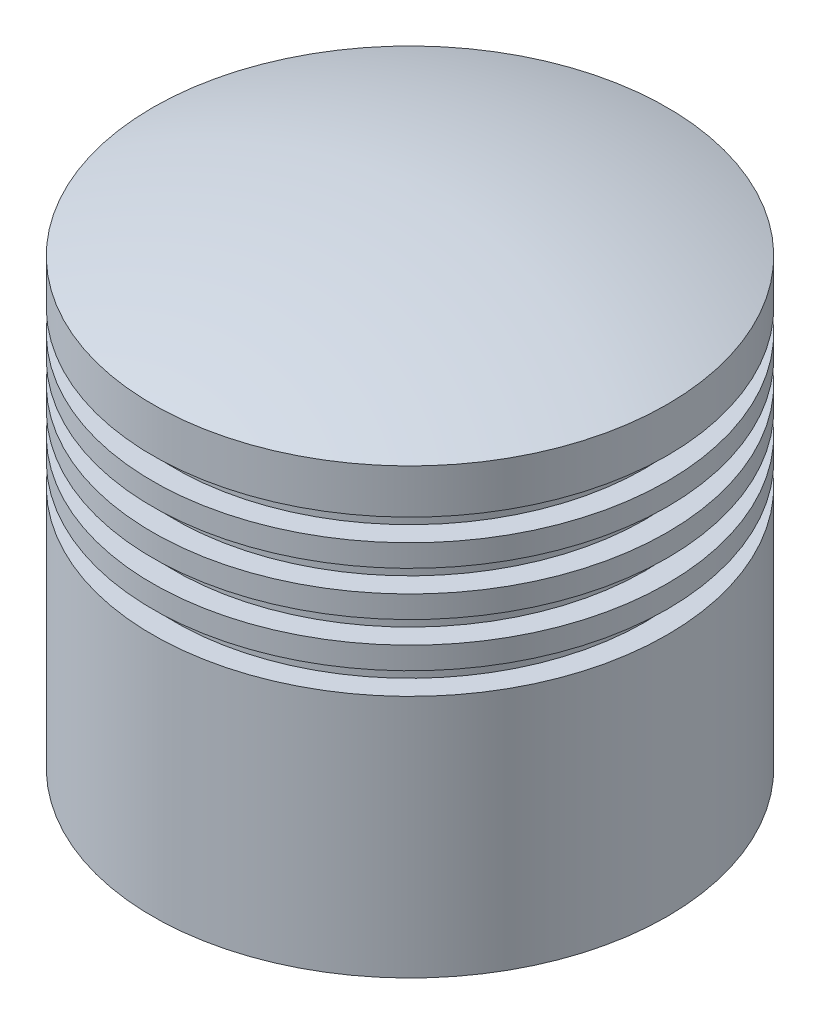
ISO-10303-21;
HEADER;
FILE_DESCRIPTION(('STEP AP214'),'2;1');
FILE_NAME('part.step','',(''),(''),'','','');
FILE_SCHEMA(('AUTOMOTIVE_DESIGN { 1 0 10303 214 1 1 1 1 }'));
ENDSEC;
DATA;
#1=APPLICATION_CONTEXT('core data for automotive mechanical design processes');
#2=APPLICATION_PROTOCOL_DEFINITION('international standard','automotive_design',2000,#1);
#3=PRODUCT_CONTEXT('',#1,'mechanical');
#4=PRODUCT('Part','Part','',(#3));
#5=PRODUCT_RELATED_PRODUCT_CATEGORY('part','',(#4));
#6=PRODUCT_DEFINITION_FORMATION('','',#4);
#7=PRODUCT_DEFINITION_CONTEXT('part definition',#1,'design');
#8=PRODUCT_DEFINITION('design','',#6,#7);
#9=PRODUCT_DEFINITION_SHAPE('','',#8);
#10=(LENGTH_UNIT() NAMED_UNIT(*) SI_UNIT(.MILLI.,.METRE.));
#11=(NAMED_UNIT(*) PLANE_ANGLE_UNIT() SI_UNIT($,.RADIAN.));
#12=(NAMED_UNIT(*) SI_UNIT($,.STERADIAN.) SOLID_ANGLE_UNIT());
#13=UNCERTAINTY_MEASURE_WITH_UNIT(LENGTH_MEASURE(1.E-05),#10,'distance_accuracy_value','');
#14=(GEOMETRIC_REPRESENTATION_CONTEXT(3) GLOBAL_UNCERTAINTY_ASSIGNED_CONTEXT((#13)) GLOBAL_UNIT_ASSIGNED_CONTEXT((#10,
#11,#12)) REPRESENTATION_CONTEXT('',''));
#15=CARTESIAN_POINT('',(0.,0.,0.));
#16=DIRECTION('',(0.,0.,1.));
#17=DIRECTION('',(1.,0.,0.));
#18=AXIS2_PLACEMENT_3D('',#15,#16,#17);
#19=CARTESIAN_POINT('',(0.,0.,0.));
#20=DIRECTION('',(0.,1.,0.));
#21=DIRECTION('',(-1.,0.,0.));
#22=AXIS2_PLACEMENT_3D('',#19,#20,#21);
#23=CYLINDRICAL_SURFACE('',#22,50.);
#24=CARTESIAN_POINT('',(0.,0.,0.));
#25=DIRECTION('',(0.,1.,0.));
#26=DIRECTION('',(-1.,0.,0.));
#27=AXIS2_PLACEMENT_3D('',#24,#25,#26);
#28=CIRCLE('',#27,50.);
#29=CARTESIAN_POINT('',(-50.,0.,0.));
#30=VERTEX_POINT('',#29);
#31=EDGE_CURVE('E10',#30,#30,#28,.T.);
#32=ORIENTED_EDGE('',*,*,#31,.F.);
#33=EDGE_LOOP('',(#32));
#34=FACE_BOUND('',#33,.T.);
#35=CARTESIAN_POINT('',(0.,30.,0.));
#36=DIRECTION('',(0.,1.,0.));
#37=DIRECTION('',(-1.,0.,0.));
#38=AXIS2_PLACEMENT_3D('',#35,#36,#37);
#39=CIRCLE('',#38,50.);
#40=CARTESIAN_POINT('',(-50.,30.,0.));
#41=VERTEX_POINT('',#40);
#42=EDGE_CURVE('E103',#41,#41,#39,.T.);
#43=ORIENTED_EDGE('',*,*,#42,.T.);
#44=EDGE_LOOP('',(#43));
#45=FACE_BOUND('',#44,.T.);
#46=ADVANCED_FACE('F33',(#34,#45),#23,.F.);
#47=CARTESIAN_POINT('',(50.,0.,0.));
#48=DIRECTION('',(0.,1.,0.));
#49=DIRECTION('',(-1.,0.,0.));
#50=AXIS2_PLACEMENT_3D('',#47,#48,#49);
#51=PLANE('',#50);
#52=CARTESIAN_POINT('',(0.,0.,0.));
#53=DIRECTION('',(0.,1.,0.));
#54=DIRECTION('',(-1.,0.,0.));
#55=AXIS2_PLACEMENT_3D('',#52,#53,#54);
#56=CIRCLE('',#55,58.);
#57=CARTESIAN_POINT('',(-58.,0.,0.));
#58=VERTEX_POINT('',#57);
#59=EDGE_CURVE('E39',#58,#58,#56,.T.);
#60=ORIENTED_EDGE('',*,*,#59,.F.);
#61=EDGE_LOOP('',(#60));
#62=FACE_BOUND('',#61,.T.);
#63=ORIENTED_EDGE('',*,*,#31,.T.);
#64=EDGE_LOOP('',(#63));
#65=FACE_BOUND('',#64,.T.);
#66=ADVANCED_FACE('F131',(#62,#65),#51,.F.);
#67=CARTESIAN_POINT('',(0.,0.,0.));
#68=DIRECTION('',(0.,1.,0.));
#69=DIRECTION('',(-1.,0.,0.));
#70=AXIS2_PLACEMENT_3D('',#67,#68,#69);
#71=CYLINDRICAL_SURFACE('',#70,58.);
#72=CARTESIAN_POINT('',(0.,55.,0.));
#73=DIRECTION('',(0.,1.,0.));
#74=DIRECTION('',(-1.,0.,0.));
#75=AXIS2_PLACEMENT_3D('',#72,#73,#74);
#76=CIRCLE('',#75,58.);
#77=CARTESIAN_POINT('',(-58.,55.,0.));
#78=VERTEX_POINT('',#77);
#79=EDGE_CURVE('E43',#78,#78,#76,.T.);
#80=ORIENTED_EDGE('',*,*,#79,.F.);
#81=EDGE_LOOP('',(#80));
#82=FACE_BOUND('',#81,.T.);
#83=ORIENTED_EDGE('',*,*,#59,.T.);
#84=EDGE_LOOP('',(#83));
#85=FACE_BOUND('',#84,.T.);
#86=ADVANCED_FACE('F136',(#82,#85),#71,.T.);
#87=CARTESIAN_POINT('',(58.,55.,0.));
#88=DIRECTION('',(0.,-1.,0.));
#89=DIRECTION('',(1.,0.,0.));
#90=AXIS2_PLACEMENT_3D('',#87,#88,#89);
#91=PLANE('',#90);
#92=CARTESIAN_POINT('',(0.,55.,0.));
#93=DIRECTION('',(0.,1.,0.));
#94=DIRECTION('',(-1.,0.,0.));
#95=AXIS2_PLACEMENT_3D('',#92,#93,#94);
#96=CIRCLE('',#95,53.);
#97=CARTESIAN_POINT('',(-53.,55.,0.));
#98=VERTEX_POINT('',#97);
#99=EDGE_CURVE('E47',#98,#98,#96,.T.);
#100=ORIENTED_EDGE('',*,*,#99,.F.);
#101=EDGE_LOOP('',(#100));
#102=FACE_BOUND('',#101,.T.);
#103=ORIENTED_EDGE('',*,*,#79,.T.);
#104=EDGE_LOOP('',(#103));
#105=FACE_BOUND('',#104,.T.);
#106=ADVANCED_FACE('F141',(#102,#105),#91,.F.);
#107=CARTESIAN_POINT('',(0.,0.,0.));
#108=DIRECTION('',(0.,1.,0.));
#109=DIRECTION('',(-1.,0.,0.));
#110=AXIS2_PLACEMENT_3D('',#107,#108,#109);
#111=CYLINDRICAL_SURFACE('',#110,53.);
#112=CARTESIAN_POINT('',(0.,60.,0.));
#113=DIRECTION('',(0.,1.,0.));
#114=DIRECTION('',(-1.,0.,0.));
#115=AXIS2_PLACEMENT_3D('',#112,#113,#114);
#116=CIRCLE('',#115,53.);
#117=CARTESIAN_POINT('',(-53.,60.,0.));
#118=VERTEX_POINT('',#117);
#119=EDGE_CURVE('E52',#118,#118,#116,.T.);
#120=ORIENTED_EDGE('',*,*,#119,.F.);
#121=EDGE_LOOP('',(#120));
#122=FACE_BOUND('',#121,.T.);
#123=ORIENTED_EDGE('',*,*,#99,.T.);
#124=EDGE_LOOP('',(#123));
#125=FACE_BOUND('',#124,.T.);
#126=ADVANCED_FACE('F147',(#122,#125),#111,.T.);
#127=CARTESIAN_POINT('',(53.,60.,0.));
#128=DIRECTION('',(0.,1.,0.));
#129=DIRECTION('',(-1.,0.,0.));
#130=AXIS2_PLACEMENT_3D('',#127,#128,#129);
#131=PLANE('',#130);
#132=CARTESIAN_POINT('',(0.,60.,0.));
#133=DIRECTION('',(0.,1.,0.));
#134=DIRECTION('',(-1.,0.,0.));
#135=AXIS2_PLACEMENT_3D('',#132,#133,#134);
#136=CIRCLE('',#135,58.);
#137=CARTESIAN_POINT('',(-58.,60.,0.));
#138=VERTEX_POINT('',#137);
#139=EDGE_CURVE('E55',#138,#138,#136,.T.);
#140=ORIENTED_EDGE('',*,*,#139,.F.);
#141=EDGE_LOOP('',(#140));
#142=FACE_BOUND('',#141,.T.);
#143=ORIENTED_EDGE('',*,*,#119,.T.);
#144=EDGE_LOOP('',(#143));
#145=FACE_BOUND('',#144,.T.);
#146=ADVANCED_FACE('F151',(#142,#145),#131,.F.);
#147=CARTESIAN_POINT('',(0.,0.,0.));
#148=DIRECTION('',(0.,1.,0.));
#149=DIRECTION('',(-1.,0.,0.));
#150=AXIS2_PLACEMENT_3D('',#147,#148,#149);
#151=CYLINDRICAL_SURFACE('',#150,58.);
#152=CARTESIAN_POINT('',(0.,65.,0.));
#153=DIRECTION('',(0.,1.,0.));
#154=DIRECTION('',(-1.,0.,0.));
#155=AXIS2_PLACEMENT_3D('',#152,#153,#154);
#156=CIRCLE('',#155,58.);
#157=CARTESIAN_POINT('',(-58.,65.,0.));
#158=VERTEX_POINT('',#157);
#159=EDGE_CURVE('E58',#158,#158,#156,.T.);
#160=ORIENTED_EDGE('',*,*,#159,.F.);
#161=EDGE_LOOP('',(#160));
#162=FACE_BOUND('',#161,.T.);
#163=ORIENTED_EDGE('',*,*,#139,.T.);
#164=EDGE_LOOP('',(#163));
#165=FACE_BOUND('',#164,.T.);
#166=ADVANCED_FACE('F155',(#162,#165),#151,.T.);
#167=CARTESIAN_POINT('',(58.,65.,0.));
#168=DIRECTION('',(0.,-1.,0.));
#169=DIRECTION('',(1.,0.,0.));
#170=AXIS2_PLACEMENT_3D('',#167,#168,#169);
#171=PLANE('',#170);
#172=CARTESIAN_POINT('',(0.,65.,0.));
#173=DIRECTION('',(0.,1.,0.));
#174=DIRECTION('',(-1.,0.,0.));
#175=AXIS2_PLACEMENT_3D('',#172,#173,#174);
#176=CIRCLE('',#175,53.);
#177=CARTESIAN_POINT('',(-53.,65.,0.));
#178=VERTEX_POINT('',#177);
#179=EDGE_CURVE('E61',#178,#178,#176,.T.);
#180=ORIENTED_EDGE('',*,*,#179,.F.);
#181=EDGE_LOOP('',(#180));
#182=FACE_BOUND('',#181,.T.);
#183=ORIENTED_EDGE('',*,*,#159,.T.);
#184=EDGE_LOOP('',(#183));
#185=FACE_BOUND('',#184,.T.);
#186=ADVANCED_FACE('F159',(#182,#185),#171,.F.);
#187=CARTESIAN_POINT('',(0.,0.,0.));
#188=DIRECTION('',(0.,1.,0.));
#189=DIRECTION('',(-1.,0.,0.));
#190=AXIS2_PLACEMENT_3D('',#187,#188,#189);
#191=CYLINDRICAL_SURFACE('',#190,53.);
#192=CARTESIAN_POINT('',(0.,70.,0.));
#193=DIRECTION('',(0.,1.,0.));
#194=DIRECTION('',(-1.,0.,0.));
#195=AXIS2_PLACEMENT_3D('',#192,#193,#194);
#196=CIRCLE('',#195,53.);
#197=CARTESIAN_POINT('',(-53.,70.,0.));
#198=VERTEX_POINT('',#197);
#199=EDGE_CURVE('E64',#198,#198,#196,.T.);
#200=ORIENTED_EDGE('',*,*,#199,.F.);
#201=EDGE_LOOP('',(#200));
#202=FACE_BOUND('',#201,.T.);
#203=ORIENTED_EDGE('',*,*,#179,.T.);
#204=EDGE_LOOP('',(#203));
#205=FACE_BOUND('',#204,.T.);
#206=ADVANCED_FACE('F163',(#202,#205),#191,.T.);
#207=CARTESIAN_POINT('',(53.,70.,0.));
#208=DIRECTION('',(0.,1.,0.));
#209=DIRECTION('',(-1.,0.,0.));
#210=AXIS2_PLACEMENT_3D('',#207,#208,#209);
#211=PLANE('',#210);
#212=CARTESIAN_POINT('',(0.,70.,0.));
#213=DIRECTION('',(0.,1.,0.));
#214=DIRECTION('',(-1.,0.,0.));
#215=AXIS2_PLACEMENT_3D('',#212,#213,#214);
#216=CIRCLE('',#215,58.);
#217=CARTESIAN_POINT('',(-58.,70.,0.));
#218=VERTEX_POINT('',#217);
#219=EDGE_CURVE('E67',#218,#218,#216,.T.);
#220=ORIENTED_EDGE('',*,*,#219,.F.);
#221=EDGE_LOOP('',(#220));
#222=FACE_BOUND('',#221,.T.);
#223=ORIENTED_EDGE('',*,*,#199,.T.);
#224=EDGE_LOOP('',(#223));
#225=FACE_BOUND('',#224,.T.);
#226=ADVANCED_FACE('F167',(#222,#225),#211,.F.);
#227=CARTESIAN_POINT('',(0.,0.,0.));
#228=DIRECTION('',(0.,1.,0.));
#229=DIRECTION('',(-1.,0.,0.));
#230=AXIS2_PLACEMENT_3D('',#227,#228,#229);
#231=CYLINDRICAL_SURFACE('',#230,58.);
#232=CARTESIAN_POINT('',(0.,75.,0.));
#233=DIRECTION('',(0.,1.,0.));
#234=DIRECTION('',(-1.,0.,0.));
#235=AXIS2_PLACEMENT_3D('',#232,#233,#234);
#236=CIRCLE('',#235,58.);
#237=CARTESIAN_POINT('',(-58.,75.,0.));
#238=VERTEX_POINT('',#237);
#239=EDGE_CURVE('E70',#238,#238,#236,.T.);
#240=ORIENTED_EDGE('',*,*,#239,.F.);
#241=EDGE_LOOP('',(#240));
#242=FACE_BOUND('',#241,.T.);
#243=ORIENTED_EDGE('',*,*,#219,.T.);
#244=EDGE_LOOP('',(#243));
#245=FACE_BOUND('',#244,.T.);
#246=ADVANCED_FACE('F171',(#242,#245),#231,.T.);
#247=CARTESIAN_POINT('',(58.,75.,0.));
#248=DIRECTION('',(0.,-1.,0.));
#249=DIRECTION('',(1.,0.,0.));
#250=AXIS2_PLACEMENT_3D('',#247,#248,#249);
#251=PLANE('',#250);
#252=CARTESIAN_POINT('',(0.,75.,0.));
#253=DIRECTION('',(0.,1.,0.));
#254=DIRECTION('',(-1.,0.,0.));
#255=AXIS2_PLACEMENT_3D('',#252,#253,#254);
#256=CIRCLE('',#255,53.);
#257=CARTESIAN_POINT('',(-53.,75.,0.));
#258=VERTEX_POINT('',#257);
#259=EDGE_CURVE('E73',#258,#258,#256,.T.);
#260=ORIENTED_EDGE('',*,*,#259,.F.);
#261=EDGE_LOOP('',(#260));
#262=FACE_BOUND('',#261,.T.);
#263=ORIENTED_EDGE('',*,*,#239,.T.);
#264=EDGE_LOOP('',(#263));
#265=FACE_BOUND('',#264,.T.);
#266=ADVANCED_FACE('F175',(#262,#265),#251,.F.);
#267=CARTESIAN_POINT('',(0.,0.,0.));
#268=DIRECTION('',(0.,1.,0.));
#269=DIRECTION('',(-1.,0.,0.));
#270=AXIS2_PLACEMENT_3D('',#267,#268,#269);
#271=CYLINDRICAL_SURFACE('',#270,53.);
#272=CARTESIAN_POINT('',(0.,80.,0.));
#273=DIRECTION('',(0.,1.,0.));
#274=DIRECTION('',(-1.,0.,0.));
#275=AXIS2_PLACEMENT_3D('',#272,#273,#274);
#276=CIRCLE('',#275,53.);
#277=CARTESIAN_POINT('',(-53.,80.,0.));
#278=VERTEX_POINT('',#277);
#279=EDGE_CURVE('E76',#278,#278,#276,.T.);
#280=ORIENTED_EDGE('',*,*,#279,.F.);
#281=EDGE_LOOP('',(#280));
#282=FACE_BOUND('',#281,.T.);
#283=ORIENTED_EDGE('',*,*,#259,.T.);
#284=EDGE_LOOP('',(#283));
#285=FACE_BOUND('',#284,.T.);
#286=ADVANCED_FACE('F179',(#282,#285),#271,.T.);
#287=CARTESIAN_POINT('',(53.,80.,0.));
#288=DIRECTION('',(0.,1.,0.));
#289=DIRECTION('',(-1.,0.,0.));
#290=AXIS2_PLACEMENT_3D('',#287,#288,#289);
#291=PLANE('',#290);
#292=CARTESIAN_POINT('',(0.,80.,0.));
#293=DIRECTION('',(0.,1.,0.));
#294=DIRECTION('',(-1.,0.,0.));
#295=AXIS2_PLACEMENT_3D('',#292,#293,#294);
#296=CIRCLE('',#295,58.);
#297=CARTESIAN_POINT('',(-58.,80.,0.));
#298=VERTEX_POINT('',#297);
#299=EDGE_CURVE('E79',#298,#298,#296,.T.);
#300=ORIENTED_EDGE('',*,*,#299,.F.);
#301=EDGE_LOOP('',(#300));
#302=FACE_BOUND('',#301,.T.);
#303=ORIENTED_EDGE('',*,*,#279,.T.);
#304=EDGE_LOOP('',(#303));
#305=FACE_BOUND('',#304,.T.);
#306=ADVANCED_FACE('F183',(#302,#305),#291,.F.);
#307=CARTESIAN_POINT('',(0.,0.,0.));
#308=DIRECTION('',(0.,1.,0.));
#309=DIRECTION('',(-1.,0.,0.));
#310=AXIS2_PLACEMENT_3D('',#307,#308,#309);
#311=CYLINDRICAL_SURFACE('',#310,58.);
#312=CARTESIAN_POINT('',(0.,85.,0.));
#313=DIRECTION('',(0.,1.,0.));
#314=DIRECTION('',(-1.,0.,0.));
#315=AXIS2_PLACEMENT_3D('',#312,#313,#314);
#316=CIRCLE('',#315,58.);
#317=CARTESIAN_POINT('',(-58.,85.,0.));
#318=VERTEX_POINT('',#317);
#319=EDGE_CURVE('E82',#318,#318,#316,.T.);
#320=ORIENTED_EDGE('',*,*,#319,.F.);
#321=EDGE_LOOP('',(#320));
#322=FACE_BOUND('',#321,.T.);
#323=ORIENTED_EDGE('',*,*,#299,.T.);
#324=EDGE_LOOP('',(#323));
#325=FACE_BOUND('',#324,.T.);
#326=ADVANCED_FACE('F187',(#322,#325),#311,.T.);
#327=CARTESIAN_POINT('',(58.,85.,0.));
#328=DIRECTION('',(0.,-1.,0.));
#329=DIRECTION('',(1.,0.,0.));
#330=AXIS2_PLACEMENT_3D('',#327,#328,#329);
#331=PLANE('',#330);
#332=CARTESIAN_POINT('',(0.,85.,0.));
#333=DIRECTION('',(0.,1.,0.));
#334=DIRECTION('',(-1.,0.,0.));
#335=AXIS2_PLACEMENT_3D('',#332,#333,#334);
#336=CIRCLE('',#335,53.);
#337=CARTESIAN_POINT('',(-53.,85.,0.));
#338=VERTEX_POINT('',#337);
#339=EDGE_CURVE('E85',#338,#338,#336,.T.);
#340=ORIENTED_EDGE('',*,*,#339,.F.);
#341=EDGE_LOOP('',(#340));
#342=FACE_BOUND('',#341,.T.);
#343=ORIENTED_EDGE('',*,*,#319,.T.);
#344=EDGE_LOOP('',(#343));
#345=FACE_BOUND('',#344,.T.);
#346=ADVANCED_FACE('F191',(#342,#345),#331,.F.);
#347=CARTESIAN_POINT('',(0.,0.,0.));
#348=DIRECTION('',(0.,1.,0.));
#349=DIRECTION('',(-1.,0.,0.));
#350=AXIS2_PLACEMENT_3D('',#347,#348,#349);
#351=CYLINDRICAL_SURFACE('',#350,53.);
#352=CARTESIAN_POINT('',(0.,90.,0.));
#353=DIRECTION('',(0.,1.,0.));
#354=DIRECTION('',(-1.,0.,0.));
#355=AXIS2_PLACEMENT_3D('',#352,#353,#354);
#356=CIRCLE('',#355,53.);
#357=CARTESIAN_POINT('',(-53.,90.,0.));
#358=VERTEX_POINT('',#357);
#359=EDGE_CURVE('E88',#358,#358,#356,.T.);
#360=ORIENTED_EDGE('',*,*,#359,.F.);
#361=EDGE_LOOP('',(#360));
#362=FACE_BOUND('',#361,.T.);
#363=ORIENTED_EDGE('',*,*,#339,.T.);
#364=EDGE_LOOP('',(#363));
#365=FACE_BOUND('',#364,.T.);
#366=ADVANCED_FACE('F195',(#362,#365),#351,.T.);
#367=CARTESIAN_POINT('',(53.,90.,0.));
#368=DIRECTION('',(0.,1.,0.));
#369=DIRECTION('',(-1.,0.,0.));
#370=AXIS2_PLACEMENT_3D('',#367,#368,#369);
#371=PLANE('',#370);
#372=CARTESIAN_POINT('',(0.,90.,0.));
#373=DIRECTION('',(0.,1.,0.));
#374=DIRECTION('',(-1.,0.,0.));
#375=AXIS2_PLACEMENT_3D('',#372,#373,#374);
#376=CIRCLE('',#375,58.);
#377=CARTESIAN_POINT('',(-58.,90.,0.));
#378=VERTEX_POINT('',#377);
#379=EDGE_CURVE('E91',#378,#378,#376,.T.);
#380=ORIENTED_EDGE('',*,*,#379,.F.);
#381=EDGE_LOOP('',(#380));
#382=FACE_BOUND('',#381,.T.);
#383=ORIENTED_EDGE('',*,*,#359,.T.);
#384=EDGE_LOOP('',(#383));
#385=FACE_BOUND('',#384,.T.);
#386=ADVANCED_FACE('F199',(#382,#385),#371,.F.);
#387=CARTESIAN_POINT('',(0.,0.,0.));
#388=DIRECTION('',(0.,1.,0.));
#389=DIRECTION('',(-1.,0.,0.));
#390=AXIS2_PLACEMENT_3D('',#387,#388,#389);
#391=CYLINDRICAL_SURFACE('',#390,58.);
#392=CARTESIAN_POINT('',(0.,100.,0.));
#393=DIRECTION('',(0.,1.,0.));
#394=DIRECTION('',(-1.,0.,0.));
#395=AXIS2_PLACEMENT_3D('',#392,#393,#394);
#396=CIRCLE('',#395,58.);
#397=CARTESIAN_POINT('',(-58.,100.,0.));
#398=VERTEX_POINT('',#397);
#399=EDGE_CURVE('E94',#398,#398,#396,.T.);
#400=ORIENTED_EDGE('',*,*,#399,.F.);
#401=EDGE_LOOP('',(#400));
#402=FACE_BOUND('',#401,.T.);
#403=ORIENTED_EDGE('',*,*,#379,.T.);
#404=EDGE_LOOP('',(#403));
#405=FACE_BOUND('',#404,.T.);
#406=ADVANCED_FACE('F127',(#402,#405),#391,.T.);
#407=CARTESIAN_POINT('',(0.,-59.7998748435054,0.));
#408=DIRECTION('',(0.,1.,0.));
#409=DIRECTION('',(1.,0.,0.));
#410=AXIS2_PLACEMENT_3D('',#407,#408,#409);
#411=SPHERICAL_SURFACE('',#410,170.);
#412=ORIENTED_EDGE('',*,*,#399,.T.);
#413=EDGE_LOOP('',(#412));
#414=FACE_BOUND('',#413,.T.);
#415=ADVANCED_FACE('F122',(#414),#411,.T.);
#416=CARTESIAN_POINT('',(0.,-59.7998748435054,0.));
#417=DIRECTION('',(0.,1.,0.));
#418=DIRECTION('',(1.,0.,0.));
#419=AXIS2_PLACEMENT_3D('',#416,#417,#418);
#420=SPHERICAL_SURFACE('',#419,163.);
#421=CARTESIAN_POINT('',(0.,97.4260772127629,0.));
#422=DIRECTION('',(0.,1.,0.));
#423=DIRECTION('',(-1.,0.,0.));
#424=AXIS2_PLACEMENT_3D('',#421,#422,#423);
#425=CIRCLE('',#424,43.);
#426=CARTESIAN_POINT('',(-43.,97.4260772127629,0.));
#427=VERTEX_POINT('',#426);
#428=EDGE_CURVE('E97',#427,#427,#425,.T.);
#429=ORIENTED_EDGE('',*,*,#428,.F.);
#430=EDGE_LOOP('',(#429));
#431=FACE_BOUND('',#430,.T.);
#432=ADVANCED_FACE('F117',(#431),#420,.F.);
#433=CARTESIAN_POINT('',(0.,0.,0.));
#434=DIRECTION('',(0.,1.,0.));
#435=DIRECTION('',(-1.,0.,0.));
#436=AXIS2_PLACEMENT_3D('',#433,#434,#435);
#437=CYLINDRICAL_SURFACE('',#436,43.);
#438=CARTESIAN_POINT('',(0.,30.,0.));
#439=DIRECTION('',(0.,1.,0.));
#440=DIRECTION('',(-1.,0.,0.));
#441=AXIS2_PLACEMENT_3D('',#438,#439,#440);
#442=CIRCLE('',#441,43.);
#443=CARTESIAN_POINT('',(-43.,30.,0.));
#444=VERTEX_POINT('',#443);
#445=EDGE_CURVE('E100',#444,#444,#442,.T.);
#446=ORIENTED_EDGE('',*,*,#445,.F.);
#447=EDGE_LOOP('',(#446));
#448=FACE_BOUND('',#447,.T.);
#449=ORIENTED_EDGE('',*,*,#428,.T.);
#450=EDGE_LOOP('',(#449));
#451=FACE_BOUND('',#450,.T.);
#452=ADVANCED_FACE('F111',(#448,#451),#437,.F.);
#453=CARTESIAN_POINT('',(50.,30.,0.));
#454=DIRECTION('',(0.,1.,0.));
#455=DIRECTION('',(-1.,0.,0.));
#456=AXIS2_PLACEMENT_3D('',#453,#454,#455);
#457=PLANE('',#456);
#458=ORIENTED_EDGE('',*,*,#42,.F.);
#459=EDGE_LOOP('',(#458));
#460=FACE_BOUND('',#459,.T.);
#461=ORIENTED_EDGE('',*,*,#445,.T.);
#462=EDGE_LOOP('',(#461));
#463=FACE_BOUND('',#462,.T.);
#464=ADVANCED_FACE('F108',(#460,#463),#457,.F.);
#465=CLOSED_SHELL('',(#46,#66,#86,#106,#126,#146,#166,#186,#206,#226,#246,#266,#286,#306,#326,
#346,#366,#386,#406,#415,#432,#452,#464));
#466=MANIFOLD_SOLID_BREP('B2',#465);
#467=ADVANCED_BREP_SHAPE_REPRESENTATION('',(#18,#466),#14);
#468=SHAPE_DEFINITION_REPRESENTATION(#9,#467);
ENDSEC;
END-ISO-10303-21;
